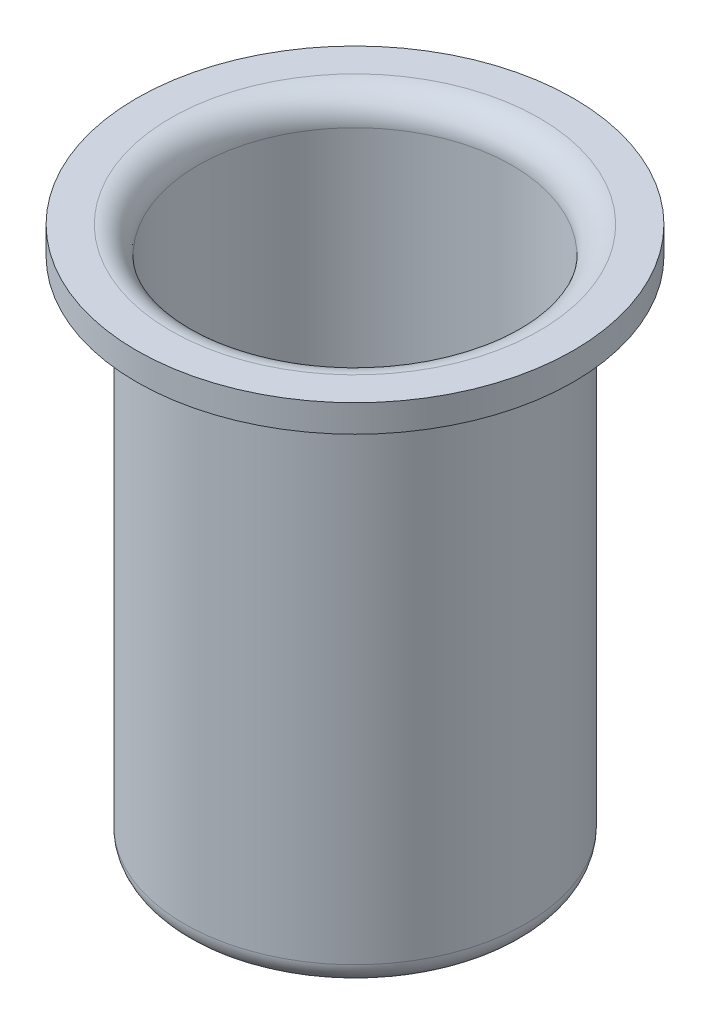
ISO-10303-21;
HEADER;
FILE_DESCRIPTION(('STEP AP214'),'2;1');
FILE_NAME('part.step','',(''),(''),'','','');
FILE_SCHEMA(('AUTOMOTIVE_DESIGN { 1 0 10303 214 1 1 1 1 }'));
ENDSEC;
DATA;
#1=APPLICATION_CONTEXT('core data for automotive mechanical design processes');
#2=APPLICATION_PROTOCOL_DEFINITION('international standard','automotive_design',2000,#1);
#3=PRODUCT_CONTEXT('',#1,'mechanical');
#4=PRODUCT('Part','Part','',(#3));
#5=PRODUCT_RELATED_PRODUCT_CATEGORY('part','',(#4));
#6=PRODUCT_DEFINITION_FORMATION('','',#4);
#7=PRODUCT_DEFINITION_CONTEXT('part definition',#1,'design');
#8=PRODUCT_DEFINITION('design','',#6,#7);
#9=PRODUCT_DEFINITION_SHAPE('','',#8);
#10=(LENGTH_UNIT() NAMED_UNIT(*) SI_UNIT(.MILLI.,.METRE.));
#11=(NAMED_UNIT(*) PLANE_ANGLE_UNIT() SI_UNIT($,.RADIAN.));
#12=(NAMED_UNIT(*) SI_UNIT($,.STERADIAN.) SOLID_ANGLE_UNIT());
#13=UNCERTAINTY_MEASURE_WITH_UNIT(LENGTH_MEASURE(1.E-05),#10,'distance_accuracy_value','');
#14=(GEOMETRIC_REPRESENTATION_CONTEXT(3) GLOBAL_UNCERTAINTY_ASSIGNED_CONTEXT((#13)) GLOBAL_UNIT_ASSIGNED_CONTEXT((#10,
#11,#12)) REPRESENTATION_CONTEXT('',''));
#15=CARTESIAN_POINT('',(0.,0.,0.));
#16=DIRECTION('',(0.,0.,1.));
#17=DIRECTION('',(1.,0.,0.));
#18=AXIS2_PLACEMENT_3D('',#15,#16,#17);
#19=CARTESIAN_POINT('',(0.,0.,0.));
#20=DIRECTION('',(0.,-1.,0.));
#21=DIRECTION('',(0.,0.,-1.));
#22=AXIS2_PLACEMENT_3D('',#19,#20,#21);
#23=PLANE('',#22);
#24=CARTESIAN_POINT('',(0.,0.,0.));
#25=DIRECTION('',(0.,-1.,0.));
#26=DIRECTION('',(0.,0.,-1.));
#27=AXIS2_PLACEMENT_3D('',#24,#25,#26);
#28=CIRCLE('',#27,43.5);
#29=CARTESIAN_POINT('',(0.,0.,-43.5));
#30=VERTEX_POINT('',#29);
#31=EDGE_CURVE('E61',#30,#30,#28,.T.);
#32=ORIENTED_EDGE('',*,*,#31,.T.);
#33=EDGE_LOOP('',(#32));
#34=FACE_BOUND('',#33,.T.);
#35=ADVANCED_FACE('F37',(#34),#23,.T.);
#36=CARTESIAN_POINT('',(0.,6.50000000000001,0.));
#37=DIRECTION('',(0.,-1.,0.));
#38=DIRECTION('',(0.,0.,-1.));
#39=AXIS2_PLACEMENT_3D('',#36,#37,#38);
#40=TOROIDAL_SURFACE('',#39,43.5,6.5);
#41=CARTESIAN_POINT('',(0.,6.50000000000001,0.));
#42=DIRECTION('',(0.,-1.,0.));
#43=DIRECTION('',(0.,0.,-1.));
#44=AXIS2_PLACEMENT_3D('',#41,#42,#43);
#45=CIRCLE('',#44,50.);
#46=CARTESIAN_POINT('',(0.,6.50000000000001,-50.));
#47=VERTEX_POINT('',#46);
#48=EDGE_CURVE('E65',#47,#47,#45,.T.);
#49=ORIENTED_EDGE('',*,*,#48,.T.);
#50=EDGE_LOOP('',(#49));
#51=FACE_BOUND('',#50,.T.);
#52=ORIENTED_EDGE('',*,*,#31,.F.);
#53=EDGE_LOOP('',(#52));
#54=FACE_BOUND('',#53,.T.);
#55=ADVANCED_FACE('F101',(#51,#54),#40,.T.);
#56=CARTESIAN_POINT('',(0.,0.,0.));
#57=DIRECTION('',(0.,-1.,0.));
#58=DIRECTION('',(0.,0.,-1.));
#59=AXIS2_PLACEMENT_3D('',#56,#57,#58);
#60=CYLINDRICAL_SURFACE('',#59,50.);
#61=CARTESIAN_POINT('',(0.,147.,0.));
#62=DIRECTION('',(0.,-1.,0.));
#63=DIRECTION('',(0.,0.,-1.));
#64=AXIS2_PLACEMENT_3D('',#61,#62,#63);
#65=CIRCLE('',#64,50.);
#66=CARTESIAN_POINT('',(0.,147.,-50.));
#67=VERTEX_POINT('',#66);
#68=EDGE_CURVE('E55',#67,#67,#65,.T.);
#69=ORIENTED_EDGE('',*,*,#68,.T.);
#70=EDGE_LOOP('',(#69));
#71=FACE_BOUND('',#70,.T.);
#72=ORIENTED_EDGE('',*,*,#48,.F.);
#73=EDGE_LOOP('',(#72));
#74=FACE_BOUND('',#73,.T.);
#75=ADVANCED_FACE('F107',(#71,#74),#60,.T.);
#76=CARTESIAN_POINT('',(50.,151.,0.));
#77=DIRECTION('',(0.,-1.,0.));
#78=DIRECTION('',(0.,0.,-1.));
#79=AXIS2_PLACEMENT_3D('',#76,#77,#78);
#80=PLANE('',#79);
#81=CARTESIAN_POINT('',(0.,151.,0.));
#82=DIRECTION('',(0.,-1.,0.));
#83=DIRECTION('',(0.,0.,-1.));
#84=AXIS2_PLACEMENT_3D('',#81,#82,#83);
#85=CIRCLE('',#84,54.);
#86=CARTESIAN_POINT('',(0.,151.,-54.));
#87=VERTEX_POINT('',#86);
#88=EDGE_CURVE('E50',#87,#87,#85,.F.);
#89=ORIENTED_EDGE('',*,*,#88,.T.);
#90=EDGE_LOOP('',(#89));
#91=FACE_BOUND('',#90,.T.);
#92=CARTESIAN_POINT('',(0.,151.,0.));
#93=DIRECTION('',(0.,-1.,0.));
#94=DIRECTION('',(0.,0.,-1.));
#95=AXIS2_PLACEMENT_3D('',#92,#93,#94);
#96=CIRCLE('',#95,64.);
#97=CARTESIAN_POINT('',(0.,151.,-64.));
#98=VERTEX_POINT('',#97);
#99=EDGE_CURVE('E69',#98,#98,#96,.T.);
#100=ORIENTED_EDGE('',*,*,#99,.T.);
#101=EDGE_LOOP('',(#100));
#102=FACE_BOUND('',#101,.T.);
#103=ADVANCED_FACE('F113',(#91,#102),#80,.T.);
#104=CARTESIAN_POINT('',(0.,0.,0.));
#105=DIRECTION('',(0.,-1.,0.));
#106=DIRECTION('',(0.,0.,-1.));
#107=AXIS2_PLACEMENT_3D('',#104,#105,#106);
#108=CYLINDRICAL_SURFACE('',#107,64.);
#109=CARTESIAN_POINT('',(0.,159.,0.));
#110=DIRECTION('',(0.,-1.,0.));
#111=DIRECTION('',(0.,0.,-1.));
#112=AXIS2_PLACEMENT_3D('',#109,#110,#111);
#113=CIRCLE('',#112,64.);
#114=CARTESIAN_POINT('',(0.,159.,-64.));
#115=VERTEX_POINT('',#114);
#116=EDGE_CURVE('E73',#115,#115,#113,.T.);
#117=ORIENTED_EDGE('',*,*,#116,.T.);
#118=EDGE_LOOP('',(#117));
#119=FACE_BOUND('',#118,.T.);
#120=ORIENTED_EDGE('',*,*,#99,.F.);
#121=EDGE_LOOP('',(#120));
#122=FACE_BOUND('',#121,.T.);
#123=ADVANCED_FACE('F117',(#119,#122),#108,.T.);
#124=CARTESIAN_POINT('',(64.,159.,0.));
#125=DIRECTION('',(0.,1.,0.));
#126=DIRECTION('',(0.,0.,1.));
#127=AXIS2_PLACEMENT_3D('',#124,#125,#126);
#128=PLANE('',#127);
#129=CARTESIAN_POINT('',(0.,159.,0.));
#130=DIRECTION('',(0.,1.,0.));
#131=DIRECTION('',(0.,0.,1.));
#132=AXIS2_PLACEMENT_3D('',#129,#130,#131);
#133=CIRCLE('',#132,54.);
#134=CARTESIAN_POINT('',(0.,159.,54.));
#135=VERTEX_POINT('',#134);
#136=EDGE_CURVE('E45',#135,#135,#133,.F.);
#137=ORIENTED_EDGE('',*,*,#136,.T.);
#138=EDGE_LOOP('',(#137));
#139=FACE_BOUND('',#138,.T.);
#140=ORIENTED_EDGE('',*,*,#116,.F.);
#141=EDGE_LOOP('',(#140));
#142=FACE_BOUND('',#141,.T.);
#143=ADVANCED_FACE('F121',(#139,#142),#128,.T.);
#144=CARTESIAN_POINT('',(0.,0.,0.));
#145=DIRECTION('',(0.,-1.,0.));
#146=DIRECTION('',(0.,0.,-1.));
#147=AXIS2_PLACEMENT_3D('',#144,#145,#146);
#148=CYLINDRICAL_SURFACE('',#147,46.);
#149=CARTESIAN_POINT('',(0.,151.,0.));
#150=DIRECTION('',(0.,1.,0.));
#151=DIRECTION('',(0.,0.,1.));
#152=AXIS2_PLACEMENT_3D('',#149,#150,#151);
#153=CIRCLE('',#152,46.);
#154=CARTESIAN_POINT('',(0.,151.,46.));
#155=VERTEX_POINT('',#154);
#156=EDGE_CURVE('E10',#155,#155,#153,.T.);
#157=ORIENTED_EDGE('',*,*,#156,.T.);
#158=EDGE_LOOP('',(#157));
#159=FACE_BOUND('',#158,.T.);
#160=CARTESIAN_POINT('',(0.,6.50000000000001,0.));
#161=DIRECTION('',(0.,-1.,0.));
#162=DIRECTION('',(0.,0.,-1.));
#163=AXIS2_PLACEMENT_3D('',#160,#161,#162);
#164=CIRCLE('',#163,46.);
#165=CARTESIAN_POINT('',(0.,6.50000000000001,-46.));
#166=VERTEX_POINT('',#165);
#167=EDGE_CURVE('E77',#166,#166,#164,.T.);
#168=ORIENTED_EDGE('',*,*,#167,.T.);
#169=EDGE_LOOP('',(#168));
#170=FACE_BOUND('',#169,.T.);
#171=ADVANCED_FACE('F98',(#159,#170),#148,.F.);
#172=CARTESIAN_POINT('',(0.,6.50000000000001,0.));
#173=DIRECTION('',(0.,-1.,0.));
#174=DIRECTION('',(0.,0.,-1.));
#175=AXIS2_PLACEMENT_3D('',#172,#173,#174);
#176=TOROIDAL_SURFACE('',#175,43.5,2.49999999999999);
#177=CARTESIAN_POINT('',(0.,4.00000000000001,0.));
#178=DIRECTION('',(0.,-1.,0.));
#179=DIRECTION('',(0.,0.,-1.));
#180=AXIS2_PLACEMENT_3D('',#177,#178,#179);
#181=CIRCLE('',#180,43.5);
#182=CARTESIAN_POINT('',(0.,4.00000000000001,-43.5));
#183=VERTEX_POINT('',#182);
#184=EDGE_CURVE('E81',#183,#183,#181,.T.);
#185=ORIENTED_EDGE('',*,*,#184,.T.);
#186=EDGE_LOOP('',(#185));
#187=FACE_BOUND('',#186,.T.);
#188=ORIENTED_EDGE('',*,*,#167,.F.);
#189=EDGE_LOOP('',(#188));
#190=FACE_BOUND('',#189,.T.);
#191=ADVANCED_FACE('F86',(#187,#190),#176,.F.);
#192=CARTESIAN_POINT('',(43.5,4.00000000000001,0.));
#193=DIRECTION('',(0.,1.,0.));
#194=DIRECTION('',(0.,0.,1.));
#195=AXIS2_PLACEMENT_3D('',#192,#193,#194);
#196=PLANE('',#195);
#197=ORIENTED_EDGE('',*,*,#184,.F.);
#198=EDGE_LOOP('',(#197));
#199=FACE_BOUND('',#198,.T.);
#200=ADVANCED_FACE('F89',(#199),#196,.T.);
#201=CARTESIAN_POINT('',(0.,147.,0.));
#202=DIRECTION('',(0.,-1.,0.));
#203=DIRECTION('',(0.,0.,-1.));
#204=AXIS2_PLACEMENT_3D('',#201,#202,#203);
#205=TOROIDAL_SURFACE('',#204,54.,4.);
#206=ORIENTED_EDGE('',*,*,#88,.F.);
#207=EDGE_LOOP('',(#206));
#208=FACE_BOUND('',#207,.T.);
#209=ORIENTED_EDGE('',*,*,#68,.F.);
#210=EDGE_LOOP('',(#209));
#211=FACE_BOUND('',#210,.T.);
#212=ADVANCED_FACE('F91',(#208,#211),#205,.F.);
#213=CARTESIAN_POINT('',(0.,151.,0.));
#214=DIRECTION('',(0.,1.,0.));
#215=DIRECTION('',(0.,0.,1.));
#216=AXIS2_PLACEMENT_3D('',#213,#214,#215);
#217=TOROIDAL_SURFACE('',#216,54.,8.);
#218=ORIENTED_EDGE('',*,*,#156,.F.);
#219=EDGE_LOOP('',(#218));
#220=FACE_BOUND('',#219,.T.);
#221=ORIENTED_EDGE('',*,*,#136,.F.);
#222=EDGE_LOOP('',(#221));
#223=FACE_BOUND('',#222,.T.);
#224=ADVANCED_FACE('F39',(#220,#223),#217,.T.);
#225=CLOSED_SHELL('',(#35,#55,#75,#103,#123,#143,#171,#191,#200,#212,#224));
#226=MANIFOLD_SOLID_BREP('B2',#225);
#227=ADVANCED_BREP_SHAPE_REPRESENTATION('',(#18,#226),#14);
#228=SHAPE_DEFINITION_REPRESENTATION(#9,#227);
ENDSEC;
END-ISO-10303-21;
